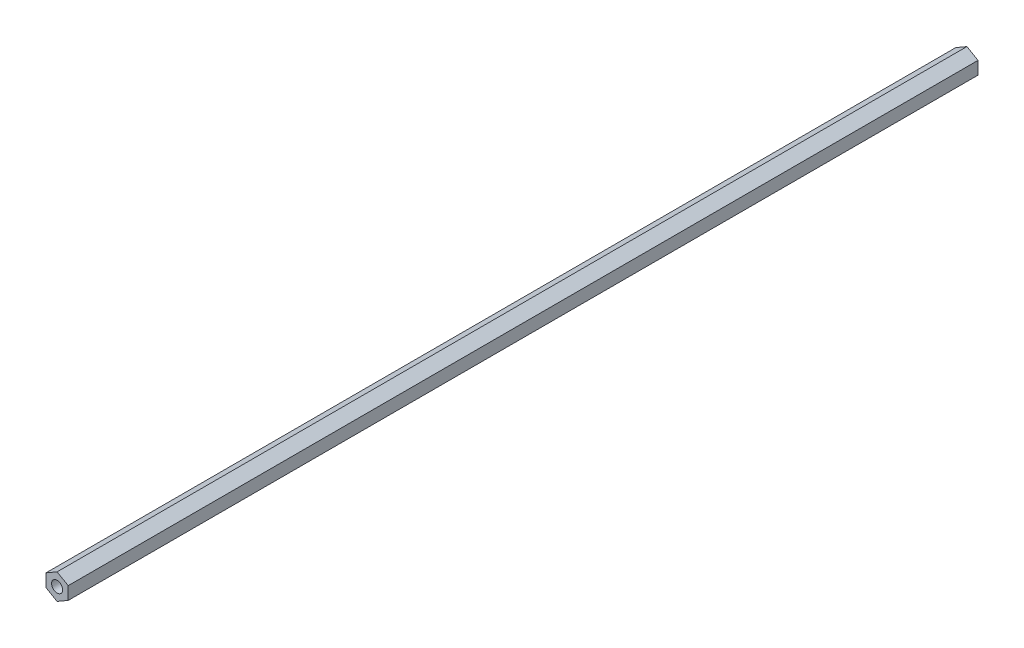
ISO-10303-21;
HEADER;
FILE_DESCRIPTION(('STEP AP214'),'2;1');
FILE_NAME('part.step','',(''),(''),'','','');
FILE_SCHEMA(('AUTOMOTIVE_DESIGN { 1 0 10303 214 1 1 1 1 }'));
ENDSEC;
DATA;
#1=APPLICATION_CONTEXT('core data for automotive mechanical design processes');
#2=APPLICATION_PROTOCOL_DEFINITION('international standard','automotive_design',2000,#1);
#3=PRODUCT_CONTEXT('',#1,'mechanical');
#4=PRODUCT('Part','Part','',(#3));
#5=PRODUCT_RELATED_PRODUCT_CATEGORY('part','',(#4));
#6=PRODUCT_DEFINITION_FORMATION('','',#4);
#7=PRODUCT_DEFINITION_CONTEXT('part definition',#1,'design');
#8=PRODUCT_DEFINITION('design','',#6,#7);
#9=PRODUCT_DEFINITION_SHAPE('','',#8);
#10=(LENGTH_UNIT() NAMED_UNIT(*) SI_UNIT(.MILLI.,.METRE.));
#11=(NAMED_UNIT(*) PLANE_ANGLE_UNIT() SI_UNIT($,.RADIAN.));
#12=(NAMED_UNIT(*) SI_UNIT($,.STERADIAN.) SOLID_ANGLE_UNIT());
#13=UNCERTAINTY_MEASURE_WITH_UNIT(LENGTH_MEASURE(1.E-05),#10,'distance_accuracy_value','');
#14=(GEOMETRIC_REPRESENTATION_CONTEXT(3) GLOBAL_UNCERTAINTY_ASSIGNED_CONTEXT((#13)) GLOBAL_UNIT_ASSIGNED_CONTEXT((#10,
#11,#12)) REPRESENTATION_CONTEXT('',''));
#15=CARTESIAN_POINT('',(0.,0.,0.));
#16=DIRECTION('',(0.,0.,1.));
#17=DIRECTION('',(1.,0.,0.));
#18=AXIS2_PLACEMENT_3D('',#15,#16,#17);
#19=CARTESIAN_POINT('',(-6.35,3.66617420935411,260.35));
#20=DIRECTION('',(1.,0.,0.));
#21=DIRECTION('',(0.,0.,-1.));
#22=AXIS2_PLACEMENT_3D('',#19,#20,#21);
#23=PLANE('',#22);
#24=DIRECTION('',(0.,0.,-1.));
#25=VECTOR('',#24,1.);
#26=CARTESIAN_POINT('',(-6.35,3.66617420935411,260.35));
#27=LINE('',#26,#25);
#28=CARTESIAN_POINT('',(-6.35,3.66617420935411,260.35));
#29=VERTEX_POINT('',#28);
#30=CARTESIAN_POINT('',(-6.35,3.66617420935411,-260.35));
#31=VERTEX_POINT('',#30);
#32=EDGE_CURVE('E141',#29,#31,#27,.T.);
#33=ORIENTED_EDGE('',*,*,#32,.T.);
#34=DIRECTION('',(0.,-1.,0.));
#35=VECTOR('',#34,1.);
#36=CARTESIAN_POINT('',(-6.35,3.66617420935411,-260.35));
#37=LINE('',#36,#35);
#38=CARTESIAN_POINT('',(-6.35,-3.66617420935413,-260.35));
#39=VERTEX_POINT('',#38);
#40=EDGE_CURVE('E113',#31,#39,#37,.T.);
#41=ORIENTED_EDGE('',*,*,#40,.T.);
#42=DIRECTION('',(0.,0.,-1.));
#43=VECTOR('',#42,1.);
#44=CARTESIAN_POINT('',(-6.35,-3.66617420935413,260.35));
#45=LINE('',#44,#43);
#46=CARTESIAN_POINT('',(-6.35,-3.66617420935413,260.35));
#47=VERTEX_POINT('',#46);
#48=EDGE_CURVE('E11',#47,#39,#45,.T.);
#49=ORIENTED_EDGE('',*,*,#48,.F.);
#50=DIRECTION('',(0.,-1.,0.));
#51=VECTOR('',#50,1.);
#52=CARTESIAN_POINT('',(-6.35,3.66617420935411,260.35));
#53=LINE('',#52,#51);
#54=EDGE_CURVE('E131',#29,#47,#53,.T.);
#55=ORIENTED_EDGE('',*,*,#54,.F.);
#56=EDGE_LOOP('',(#33,#41,#49,#55));
#57=FACE_BOUND('',#56,.T.);
#58=ADVANCED_FACE('F37',(#57),#23,.F.);
#59=CARTESIAN_POINT('',(-6.35,-3.66617420935413,260.35));
#60=DIRECTION('',(0.5,0.866025403784439,0.));
#61=DIRECTION('',(-0.866025403784439,0.5,0.));
#62=AXIS2_PLACEMENT_3D('',#59,#60,#61);
#63=PLANE('',#62);
#64=ORIENTED_EDGE('',*,*,#48,.T.);
#65=DIRECTION('',(0.866025403784439,-0.5,0.));
#66=VECTOR('',#65,1.);
#67=CARTESIAN_POINT('',(-6.35,-3.66617420935413,-260.35));
#68=LINE('',#67,#66);
#69=CARTESIAN_POINT('',(0.,-7.33234841870826,-260.35));
#70=VERTEX_POINT('',#69);
#71=EDGE_CURVE('E116',#39,#70,#68,.T.);
#72=ORIENTED_EDGE('',*,*,#71,.T.);
#73=DIRECTION('',(0.,0.,-1.));
#74=VECTOR('',#73,1.);
#75=CARTESIAN_POINT('',(0.,-7.33234841870826,260.35));
#76=LINE('',#75,#74);
#77=CARTESIAN_POINT('',(0.,-7.33234841870826,260.35));
#78=VERTEX_POINT('',#77);
#79=EDGE_CURVE('E44',#78,#70,#76,.T.);
#80=ORIENTED_EDGE('',*,*,#79,.F.);
#81=DIRECTION('',(0.866025403784439,-0.5,0.));
#82=VECTOR('',#81,1.);
#83=CARTESIAN_POINT('',(-6.35,-3.66617420935413,260.35));
#84=LINE('',#83,#82);
#85=EDGE_CURVE('E133',#47,#78,#84,.T.);
#86=ORIENTED_EDGE('',*,*,#85,.F.);
#87=EDGE_LOOP('',(#64,#72,#80,#86));
#88=FACE_BOUND('',#87,.T.);
#89=ADVANCED_FACE('F161',(#88),#63,.F.);
#90=CARTESIAN_POINT('',(0.,-7.33234841870826,260.35));
#91=DIRECTION('',(-0.5,0.866025403784439,0.));
#92=DIRECTION('',(-0.866025403784439,-0.5,0.));
#93=AXIS2_PLACEMENT_3D('',#90,#91,#92);
#94=PLANE('',#93);
#95=ORIENTED_EDGE('',*,*,#79,.T.);
#96=DIRECTION('',(0.866025403784439,0.5,0.));
#97=VECTOR('',#96,1.);
#98=CARTESIAN_POINT('',(0.,-7.33234841870826,-260.35));
#99=LINE('',#98,#97);
#100=CARTESIAN_POINT('',(6.35,-3.66617420935414,-260.35));
#101=VERTEX_POINT('',#100);
#102=EDGE_CURVE('E119',#70,#101,#99,.T.);
#103=ORIENTED_EDGE('',*,*,#102,.T.);
#104=DIRECTION('',(0.,0.,-1.));
#105=VECTOR('',#104,1.);
#106=CARTESIAN_POINT('',(6.35,-3.66617420935414,260.35));
#107=LINE('',#106,#105);
#108=CARTESIAN_POINT('',(6.35,-3.66617420935414,260.35));
#109=VERTEX_POINT('',#108);
#110=EDGE_CURVE('E147',#109,#101,#107,.T.);
#111=ORIENTED_EDGE('',*,*,#110,.F.);
#112=DIRECTION('',(0.866025403784439,0.5,0.));
#113=VECTOR('',#112,1.);
#114=CARTESIAN_POINT('',(0.,-7.33234841870826,260.35));
#115=LINE('',#114,#113);
#116=EDGE_CURVE('E135',#78,#109,#115,.T.);
#117=ORIENTED_EDGE('',*,*,#116,.F.);
#118=EDGE_LOOP('',(#95,#103,#111,#117));
#119=FACE_BOUND('',#118,.T.);
#120=ADVANCED_FACE('F152',(#119),#94,.F.);
#121=CARTESIAN_POINT('',(6.35,-3.66617420935414,260.35));
#122=DIRECTION('',(-1.,0.,0.));
#123=DIRECTION('',(0.,-1.,0.));
#124=AXIS2_PLACEMENT_3D('',#121,#122,#123);
#125=PLANE('',#124);
#126=ORIENTED_EDGE('',*,*,#110,.T.);
#127=DIRECTION('',(0.,1.,0.));
#128=VECTOR('',#127,1.);
#129=CARTESIAN_POINT('',(6.35,-3.66617420935414,-260.35));
#130=LINE('',#129,#128);
#131=CARTESIAN_POINT('',(6.35,3.66617420935412,-260.35));
#132=VERTEX_POINT('',#131);
#133=EDGE_CURVE('E122',#101,#132,#130,.T.);
#134=ORIENTED_EDGE('',*,*,#133,.T.);
#135=DIRECTION('',(0.,0.,-1.));
#136=VECTOR('',#135,1.);
#137=CARTESIAN_POINT('',(6.35,3.66617420935412,260.35));
#138=LINE('',#137,#136);
#139=CARTESIAN_POINT('',(6.35,3.66617420935412,260.35));
#140=VERTEX_POINT('',#139);
#141=EDGE_CURVE('E145',#140,#132,#138,.T.);
#142=ORIENTED_EDGE('',*,*,#141,.F.);
#143=DIRECTION('',(0.,1.,0.));
#144=VECTOR('',#143,1.);
#145=CARTESIAN_POINT('',(6.35,-3.66617420935414,260.35));
#146=LINE('',#145,#144);
#147=EDGE_CURVE('E137',#109,#140,#146,.T.);
#148=ORIENTED_EDGE('',*,*,#147,.F.);
#149=EDGE_LOOP('',(#126,#134,#142,#148));
#150=FACE_BOUND('',#149,.T.);
#151=ADVANCED_FACE('F172',(#150),#125,.F.);
#152=CARTESIAN_POINT('',(6.35,3.66617420935412,260.35));
#153=DIRECTION('',(-0.5,-0.866025403784438,0.));
#154=DIRECTION('',(0.866025403784439,-0.5,0.));
#155=AXIS2_PLACEMENT_3D('',#152,#153,#154);
#156=PLANE('',#155);
#157=ORIENTED_EDGE('',*,*,#141,.T.);
#158=DIRECTION('',(-0.866025403784439,0.5,0.));
#159=VECTOR('',#158,1.);
#160=CARTESIAN_POINT('',(6.35,3.66617420935412,-260.35));
#161=LINE('',#160,#159);
#162=CARTESIAN_POINT('',(0.,7.33234841870824,-260.35));
#163=VERTEX_POINT('',#162);
#164=EDGE_CURVE('E125',#132,#163,#161,.T.);
#165=ORIENTED_EDGE('',*,*,#164,.T.);
#166=DIRECTION('',(0.,0.,-1.));
#167=VECTOR('',#166,1.);
#168=CARTESIAN_POINT('',(0.,7.33234841870824,260.35));
#169=LINE('',#168,#167);
#170=CARTESIAN_POINT('',(0.,7.33234841870824,260.35));
#171=VERTEX_POINT('',#170);
#172=EDGE_CURVE('E143',#171,#163,#169,.T.);
#173=ORIENTED_EDGE('',*,*,#172,.F.);
#174=DIRECTION('',(-0.866025403784439,0.5,0.));
#175=VECTOR('',#174,1.);
#176=CARTESIAN_POINT('',(6.35,3.66617420935412,260.35));
#177=LINE('',#176,#175);
#178=EDGE_CURVE('E56',#140,#171,#177,.T.);
#179=ORIENTED_EDGE('',*,*,#178,.F.);
#180=EDGE_LOOP('',(#157,#165,#173,#179));
#181=FACE_BOUND('',#180,.T.);
#182=ADVANCED_FACE('F169',(#181),#156,.F.);
#183=CARTESIAN_POINT('',(0.,7.33234841870824,260.35));
#184=DIRECTION('',(0.5,-0.866025403784439,0.));
#185=DIRECTION('',(0.866025403784439,0.5,0.));
#186=AXIS2_PLACEMENT_3D('',#183,#184,#185);
#187=PLANE('',#186);
#188=ORIENTED_EDGE('',*,*,#172,.T.);
#189=DIRECTION('',(-0.866025403784439,-0.5,0.));
#190=VECTOR('',#189,1.);
#191=CARTESIAN_POINT('',(0.,7.33234841870824,-260.35));
#192=LINE('',#191,#190);
#193=EDGE_CURVE('E128',#163,#31,#192,.T.);
#194=ORIENTED_EDGE('',*,*,#193,.T.);
#195=ORIENTED_EDGE('',*,*,#32,.F.);
#196=DIRECTION('',(-0.866025403784439,-0.5,0.));
#197=VECTOR('',#196,1.);
#198=CARTESIAN_POINT('',(0.,7.33234841870824,260.35));
#199=LINE('',#198,#197);
#200=EDGE_CURVE('E51',#171,#29,#199,.T.);
#201=ORIENTED_EDGE('',*,*,#200,.F.);
#202=EDGE_LOOP('',(#188,#194,#195,#201));
#203=FACE_BOUND('',#202,.T.);
#204=ADVANCED_FACE('F167',(#203),#187,.F.);
#205=CARTESIAN_POINT('',(0.,0.,260.35));
#206=DIRECTION('',(0.,0.,1.));
#207=DIRECTION('',(1.,0.,0.));
#208=AXIS2_PLACEMENT_3D('',#205,#206,#207);
#209=PLANE('',#208);
#210=CARTESIAN_POINT('',(0.,0.,260.35));
#211=DIRECTION('',(0.,0.,1.));
#212=DIRECTION('',(1.,0.,0.));
#213=AXIS2_PLACEMENT_3D('',#210,#211,#212);
#214=CIRCLE('',#213,3.17499999999999);
#215=CARTESIAN_POINT('',(3.17499999999999,0.,260.35));
#216=VERTEX_POINT('',#215);
#217=EDGE_CURVE('E102',#216,#216,#214,.T.);
#218=ORIENTED_EDGE('',*,*,#217,.F.);
#219=EDGE_LOOP('',(#218));
#220=FACE_BOUND('',#219,.T.);
#221=ORIENTED_EDGE('',*,*,#54,.T.);
#222=ORIENTED_EDGE('',*,*,#85,.T.);
#223=ORIENTED_EDGE('',*,*,#116,.T.);
#224=ORIENTED_EDGE('',*,*,#147,.T.);
#225=ORIENTED_EDGE('',*,*,#178,.T.);
#226=ORIENTED_EDGE('',*,*,#200,.T.);
#227=EDGE_LOOP('',(#221,#222,#223,#224,#225,#226));
#228=FACE_BOUND('',#227,.T.);
#229=ADVANCED_FACE('F174',(#220,#228),#209,.T.);
#230=CARTESIAN_POINT('',(0.,0.,-260.35));
#231=DIRECTION('',(0.,0.,1.));
#232=DIRECTION('',(1.,0.,0.));
#233=AXIS2_PLACEMENT_3D('',#230,#231,#232);
#234=PLANE('',#233);
#235=CARTESIAN_POINT('',(0.,0.,-260.35));
#236=DIRECTION('',(0.,0.,-1.));
#237=DIRECTION('',(-1.,0.,0.));
#238=AXIS2_PLACEMENT_3D('',#235,#236,#237);
#239=CIRCLE('',#238,3.17499999999999);
#240=CARTESIAN_POINT('',(-3.17499999999999,0.,-260.35));
#241=VERTEX_POINT('',#240);
#242=EDGE_CURVE('E103',#241,#241,#239,.T.);
#243=ORIENTED_EDGE('',*,*,#242,.F.);
#244=EDGE_LOOP('',(#243));
#245=FACE_BOUND('',#244,.T.);
#246=ORIENTED_EDGE('',*,*,#40,.F.);
#247=ORIENTED_EDGE('',*,*,#193,.F.);
#248=ORIENTED_EDGE('',*,*,#164,.F.);
#249=ORIENTED_EDGE('',*,*,#133,.F.);
#250=ORIENTED_EDGE('',*,*,#102,.F.);
#251=ORIENTED_EDGE('',*,*,#71,.F.);
#252=EDGE_LOOP('',(#246,#247,#248,#249,#250,#251));
#253=FACE_BOUND('',#252,.T.);
#254=ADVANCED_FACE('F159',(#245,#253),#234,.F.);
#255=CARTESIAN_POINT('',(0.,0.,234.95));
#256=DIRECTION('',(0.,0.,1.));
#257=DIRECTION('',(1.,0.,0.));
#258=AXIS2_PLACEMENT_3D('',#255,#256,#257);
#259=CONICAL_SURFACE('',#258,3.17499999999995,1.02974425867665);
#260=CARTESIAN_POINT('',(0.,0.,233.042267534588));
#261=VERTEX_POINT('',#260);
#262=VERTEX_LOOP('',#261);
#263=FACE_BOUND('',#262,.T.);
#264=CARTESIAN_POINT('',(0.,0.,234.95));
#265=DIRECTION('',(0.,0.,1.));
#266=DIRECTION('',(1.,0.,0.));
#267=AXIS2_PLACEMENT_3D('',#264,#265,#266);
#268=CIRCLE('',#267,3.17499999999995);
#269=CARTESIAN_POINT('',(3.17499999999995,0.,234.95));
#270=VERTEX_POINT('',#269);
#271=EDGE_CURVE('E106',#270,#270,#268,.T.);
#272=ORIENTED_EDGE('',*,*,#271,.T.);
#273=EDGE_LOOP('',(#272));
#274=FACE_BOUND('',#273,.T.);
#275=ADVANCED_FACE('F182',(#263,#274),#259,.F.);
#276=CARTESIAN_POINT('',(0.,0.,260.35));
#277=DIRECTION('',(0.,0.,1.));
#278=DIRECTION('',(1.,0.,0.));
#279=AXIS2_PLACEMENT_3D('',#276,#277,#278);
#280=CYLINDRICAL_SURFACE('',#279,3.17499999999997);
#281=ORIENTED_EDGE('',*,*,#271,.F.);
#282=EDGE_LOOP('',(#281));
#283=FACE_BOUND('',#282,.T.);
#284=ORIENTED_EDGE('',*,*,#217,.T.);
#285=EDGE_LOOP('',(#284));
#286=FACE_BOUND('',#285,.T.);
#287=ADVANCED_FACE('F96',(#283,#286),#280,.F.);
#288=CARTESIAN_POINT('',(0.,0.,-234.95));
#289=DIRECTION('',(0.,0.,-1.));
#290=DIRECTION('',(-1.,0.,0.));
#291=AXIS2_PLACEMENT_3D('',#288,#289,#290);
#292=CONICAL_SURFACE('',#291,3.17499999999995,1.02974425867665);
#293=CARTESIAN_POINT('',(0.,0.,-233.042267534588));
#294=VERTEX_POINT('',#293);
#295=VERTEX_LOOP('',#294);
#296=FACE_BOUND('',#295,.T.);
#297=CARTESIAN_POINT('',(0.,0.,-234.95));
#298=DIRECTION('',(0.,0.,-1.));
#299=DIRECTION('',(-1.,0.,0.));
#300=AXIS2_PLACEMENT_3D('',#297,#298,#299);
#301=CIRCLE('',#300,3.17499999999995);
#302=CARTESIAN_POINT('',(-3.17499999999995,0.,-234.95));
#303=VERTEX_POINT('',#302);
#304=EDGE_CURVE('E100',#303,#303,#301,.T.);
#305=ORIENTED_EDGE('',*,*,#304,.T.);
#306=EDGE_LOOP('',(#305));
#307=FACE_BOUND('',#306,.T.);
#308=ADVANCED_FACE('F92',(#296,#307),#292,.F.);
#309=CARTESIAN_POINT('',(0.,0.,-260.35));
#310=DIRECTION('',(0.,0.,-1.));
#311=DIRECTION('',(-1.,0.,0.));
#312=AXIS2_PLACEMENT_3D('',#309,#310,#311);
#313=CYLINDRICAL_SURFACE('',#312,3.17499999999997);
#314=ORIENTED_EDGE('',*,*,#304,.F.);
#315=EDGE_LOOP('',(#314));
#316=FACE_BOUND('',#315,.T.);
#317=ORIENTED_EDGE('',*,*,#242,.T.);
#318=EDGE_LOOP('',(#317));
#319=FACE_BOUND('',#318,.T.);
#320=ADVANCED_FACE('F95',(#316,#319),#313,.F.);
#321=CLOSED_SHELL('',(#58,#89,#120,#151,#182,#204,#229,#254,#275,#287,#308,#320));
#322=MANIFOLD_SOLID_BREP('B2',#321);
#323=ADVANCED_BREP_SHAPE_REPRESENTATION('',(#18,#322),#14);
#324=SHAPE_DEFINITION_REPRESENTATION(#9,#323);
ENDSEC;
END-ISO-10303-21;
